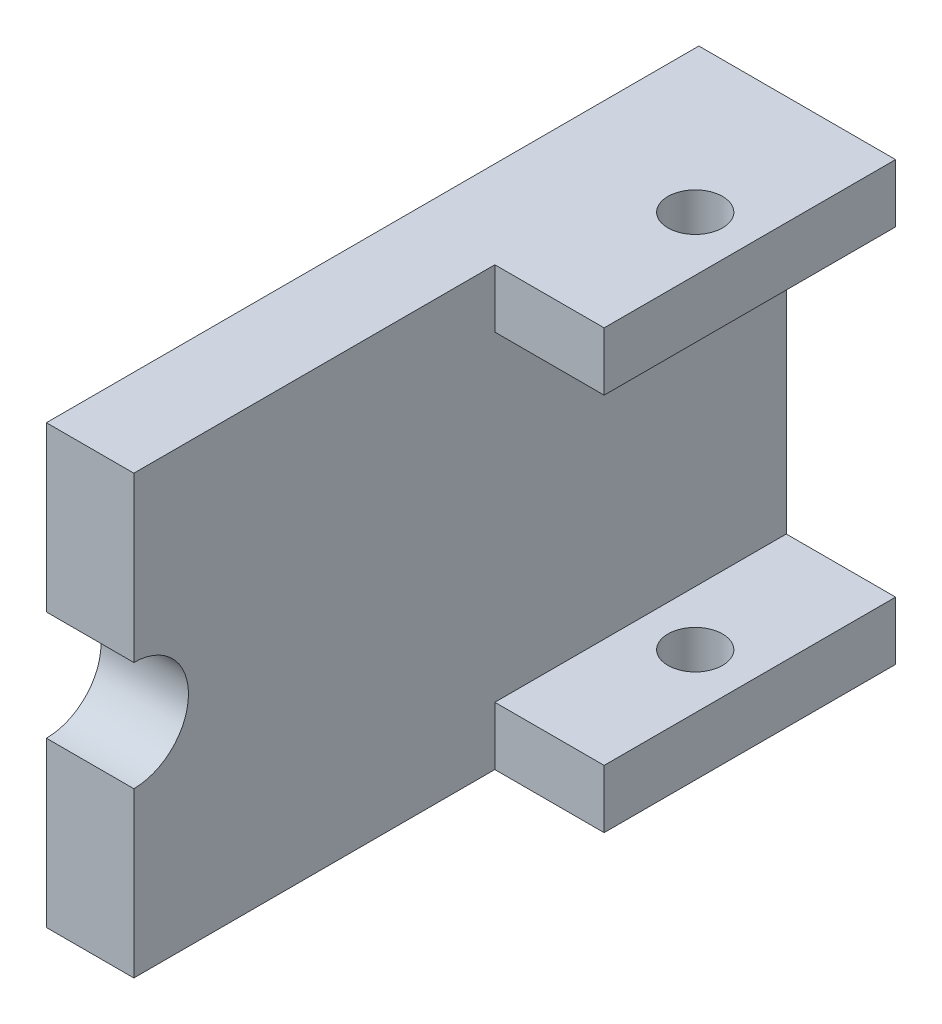
ISO-10303-21;
HEADER;
FILE_DESCRIPTION(('STEP AP214'),'2;1');
FILE_NAME('part.step','',(''),(''),'','','');
FILE_SCHEMA(('AUTOMOTIVE_DESIGN { 1 0 10303 214 1 1 1 1 }'));
ENDSEC;
DATA;
#1=APPLICATION_CONTEXT('core data for automotive mechanical design processes');
#2=APPLICATION_PROTOCOL_DEFINITION('international standard','automotive_design',2000,#1);
#3=PRODUCT_CONTEXT('',#1,'mechanical');
#4=PRODUCT('Part','Part','',(#3));
#5=PRODUCT_RELATED_PRODUCT_CATEGORY('part','',(#4));
#6=PRODUCT_DEFINITION_FORMATION('','',#4);
#7=PRODUCT_DEFINITION_CONTEXT('part definition',#1,'design');
#8=PRODUCT_DEFINITION('design','',#6,#7);
#9=PRODUCT_DEFINITION_SHAPE('','',#8);
#10=(LENGTH_UNIT() NAMED_UNIT(*) SI_UNIT(.MILLI.,.METRE.));
#11=(NAMED_UNIT(*) PLANE_ANGLE_UNIT() SI_UNIT($,.RADIAN.));
#12=(NAMED_UNIT(*) SI_UNIT($,.STERADIAN.) SOLID_ANGLE_UNIT());
#13=UNCERTAINTY_MEASURE_WITH_UNIT(LENGTH_MEASURE(1.E-05),#10,'distance_accuracy_value','');
#14=(GEOMETRIC_REPRESENTATION_CONTEXT(3) GLOBAL_UNCERTAINTY_ASSIGNED_CONTEXT((#13)) GLOBAL_UNIT_ASSIGNED_CONTEXT((#10,
#11,#12)) REPRESENTATION_CONTEXT('',''));
#15=CARTESIAN_POINT('',(0.,0.,0.));
#16=DIRECTION('',(0.,0.,1.));
#17=DIRECTION('',(1.,0.,0.));
#18=AXIS2_PLACEMENT_3D('',#15,#16,#17);
#19=CARTESIAN_POINT('',(24.765,38.1,-31.46060002));
#20=DIRECTION('',(0.,-1.,0.));
#21=DIRECTION('',(0.,0.,-1.));
#22=AXIS2_PLACEMENT_3D('',#19,#20,#21);
#23=CYLINDRICAL_SURFACE('',#22,4.7625);
#24=CARTESIAN_POINT('',(24.765,-27.94,-31.46060002));
#25=DIRECTION('',(0.,-1.,0.));
#26=DIRECTION('',(0.,0.,-1.));
#27=AXIS2_PLACEMENT_3D('',#24,#25,#26);
#28=CIRCLE('',#27,4.7625);
#29=CARTESIAN_POINT('',(24.765,-27.94,-36.22310002));
#30=VERTEX_POINT('',#29);
#31=EDGE_CURVE('E19',#30,#30,#28,.T.);
#32=ORIENTED_EDGE('',*,*,#31,.F.);
#33=EDGE_LOOP('',(#32));
#34=FACE_BOUND('',#33,.T.);
#35=CARTESIAN_POINT('',(24.765,-38.1,-31.46060002));
#36=DIRECTION('',(0.,-1.,0.));
#37=DIRECTION('',(0.,0.,-1.));
#38=AXIS2_PLACEMENT_3D('',#35,#36,#37);
#39=CIRCLE('',#38,4.7625);
#40=CARTESIAN_POINT('',(24.765,-38.1,-36.22310002));
#41=VERTEX_POINT('',#40);
#42=EDGE_CURVE('E143',#41,#41,#39,.T.);
#43=ORIENTED_EDGE('',*,*,#42,.T.);
#44=EDGE_LOOP('',(#43));
#45=FACE_BOUND('',#44,.T.);
#46=ADVANCED_FACE('F16',(#34,#45),#23,.F.);
#47=CARTESIAN_POINT('',(34.29,0.,-6.06060002000003));
#48=DIRECTION('',(0.,0.,-1.));
#49=DIRECTION('',(0.,1.,0.));
#50=AXIS2_PLACEMENT_3D('',#47,#48,#49);
#51=PLANE('',#50);
#52=DIRECTION('',(1.,0.,0.));
#53=VECTOR('',#52,1.);
#54=CARTESIAN_POINT('',(15.24,-38.1,-6.06060002000002));
#55=LINE('',#54,#53);
#56=CARTESIAN_POINT('',(15.24,-38.1,-6.06060002000002));
#57=VERTEX_POINT('',#56);
#58=CARTESIAN_POINT('',(34.29,-38.1,-6.06060002000002));
#59=VERTEX_POINT('',#58);
#60=EDGE_CURVE('E133',#57,#59,#55,.T.);
#61=ORIENTED_EDGE('',*,*,#60,.T.);
#62=DIRECTION('',(0.,1.,0.));
#63=VECTOR('',#62,1.);
#64=CARTESIAN_POINT('',(34.29,0.,-6.06060002000002));
#65=LINE('',#64,#63);
#66=CARTESIAN_POINT('',(34.29,-27.94,-6.06060002000002));
#67=VERTEX_POINT('',#66);
#68=EDGE_CURVE('E117',#67,#59,#65,.F.);
#69=ORIENTED_EDGE('',*,*,#68,.F.);
#70=DIRECTION('',(1.,0.,0.));
#71=VECTOR('',#70,1.);
#72=CARTESIAN_POINT('',(34.29,-27.94,-6.06060002000002));
#73=LINE('',#72,#71);
#74=CARTESIAN_POINT('',(15.24,-27.94,-6.06060002000002));
#75=VERTEX_POINT('',#74);
#76=EDGE_CURVE('E161',#75,#67,#73,.T.);
#77=ORIENTED_EDGE('',*,*,#76,.F.);
#78=DIRECTION('',(0.,1.,0.));
#79=VECTOR('',#78,1.);
#80=CARTESIAN_POINT('',(15.24,0.,-6.06060002000002));
#81=LINE('',#80,#79);
#82=EDGE_CURVE('E139',#57,#75,#81,.T.);
#83=ORIENTED_EDGE('',*,*,#82,.F.);
#84=EDGE_LOOP('',(#61,#69,#77,#83));
#85=FACE_BOUND('',#84,.T.);
#86=ADVANCED_FACE('F138',(#85),#51,.F.);
#87=CARTESIAN_POINT('',(34.29,0.,0.));
#88=DIRECTION('',(1.,0.,0.));
#89=DIRECTION('',(0.,0.,-1.));
#90=AXIS2_PLACEMENT_3D('',#87,#88,#89);
#91=PLANE('',#90);
#92=DIRECTION('',(0.,0.,1.));
#93=VECTOR('',#92,1.);
#94=CARTESIAN_POINT('',(34.29,-27.94,0.));
#95=LINE('',#94,#93);
#96=CARTESIAN_POINT('',(34.29,-27.94,-56.86060002));
#97=VERTEX_POINT('',#96);
#98=EDGE_CURVE('E123',#67,#97,#95,.F.);
#99=ORIENTED_EDGE('',*,*,#98,.F.);
#100=ORIENTED_EDGE('',*,*,#68,.T.);
#101=DIRECTION('',(0.,0.,1.));
#102=VECTOR('',#101,1.);
#103=CARTESIAN_POINT('',(34.29,-38.1,0.));
#104=LINE('',#103,#102);
#105=CARTESIAN_POINT('',(34.29,-38.1,-56.86060002));
#106=VERTEX_POINT('',#105);
#107=EDGE_CURVE('E121',#59,#106,#104,.F.);
#108=ORIENTED_EDGE('',*,*,#107,.T.);
#109=DIRECTION('',(0.,1.,0.));
#110=VECTOR('',#109,1.);
#111=CARTESIAN_POINT('',(34.29,0.,-56.86060002));
#112=LINE('',#111,#110);
#113=EDGE_CURVE('E193',#106,#97,#112,.T.);
#114=ORIENTED_EDGE('',*,*,#113,.T.);
#115=EDGE_LOOP('',(#99,#100,#108,#114));
#116=FACE_BOUND('',#115,.T.);
#117=ADVANCED_FACE('F119',(#116),#91,.T.);
#118=CARTESIAN_POINT('',(34.29,-27.94,0.));
#119=DIRECTION('',(0.,1.,0.));
#120=DIRECTION('',(0.,0.,1.));
#121=AXIS2_PLACEMENT_3D('',#118,#119,#120);
#122=PLANE('',#121);
#123=ORIENTED_EDGE('',*,*,#98,.T.);
#124=DIRECTION('',(1.,0.,0.));
#125=VECTOR('',#124,1.);
#126=CARTESIAN_POINT('',(15.24,-27.94,-56.86060002));
#127=LINE('',#126,#125);
#128=CARTESIAN_POINT('',(15.24,-27.94,-56.86060002));
#129=VERTEX_POINT('',#128);
#130=EDGE_CURVE('E195',#97,#129,#127,.F.);
#131=ORIENTED_EDGE('',*,*,#130,.T.);
#132=DIRECTION('',(0.,0.,-1.));
#133=VECTOR('',#132,1.);
#134=CARTESIAN_POINT('',(15.24,-27.94,0.));
#135=LINE('',#134,#133);
#136=EDGE_CURVE('E151',#75,#129,#135,.T.);
#137=ORIENTED_EDGE('',*,*,#136,.F.);
#138=ORIENTED_EDGE('',*,*,#76,.T.);
#139=EDGE_LOOP('',(#123,#131,#137,#138));
#140=FACE_BOUND('',#139,.T.);
#141=ORIENTED_EDGE('',*,*,#31,.T.);
#142=EDGE_LOOP('',(#141));
#143=FACE_BOUND('',#142,.T.);
#144=ADVANCED_FACE('F272',(#140,#143),#122,.T.);
#145=CARTESIAN_POINT('',(34.29,27.94,0.));
#146=DIRECTION('',(0.,1.,0.));
#147=DIRECTION('',(0.,0.,1.));
#148=AXIS2_PLACEMENT_3D('',#145,#146,#147);
#149=PLANE('',#148);
#150=DIRECTION('',(1.,0.,0.));
#151=VECTOR('',#150,1.);
#152=CARTESIAN_POINT('',(15.24,27.94,-56.86060002));
#153=LINE('',#152,#151);
#154=CARTESIAN_POINT('',(15.24,27.94,-56.86060002));
#155=VERTEX_POINT('',#154);
#156=CARTESIAN_POINT('',(34.29,27.94,-56.86060002));
#157=VERTEX_POINT('',#156);
#158=EDGE_CURVE('E230',#155,#157,#153,.T.);
#159=ORIENTED_EDGE('',*,*,#158,.T.);
#160=DIRECTION('',(0.,0.,-1.));
#161=VECTOR('',#160,1.);
#162=CARTESIAN_POINT('',(34.29,27.94,0.));
#163=LINE('',#162,#161);
#164=CARTESIAN_POINT('',(34.29,27.94,-6.06060002000001));
#165=VERTEX_POINT('',#164);
#166=EDGE_CURVE('E152',#165,#157,#163,.T.);
#167=ORIENTED_EDGE('',*,*,#166,.F.);
#168=DIRECTION('',(1.,0.,0.));
#169=VECTOR('',#168,1.);
#170=CARTESIAN_POINT('',(34.29,27.94,-6.06060002000001));
#171=LINE('',#170,#169);
#172=CARTESIAN_POINT('',(15.24,27.94,-6.06060002000001));
#173=VERTEX_POINT('',#172);
#174=EDGE_CURVE('E155',#173,#165,#171,.T.);
#175=ORIENTED_EDGE('',*,*,#174,.F.);
#176=DIRECTION('',(0.,0.,-1.));
#177=VECTOR('',#176,1.);
#178=CARTESIAN_POINT('',(15.24,27.94,0.));
#179=LINE('',#178,#177);
#180=EDGE_CURVE('E245',#155,#173,#179,.F.);
#181=ORIENTED_EDGE('',*,*,#180,.F.);
#182=EDGE_LOOP('',(#159,#167,#175,#181));
#183=FACE_BOUND('',#182,.T.);
#184=CARTESIAN_POINT('',(24.765,27.94,-31.46060002));
#185=DIRECTION('',(0.,-1.,0.));
#186=DIRECTION('',(0.,0.,-1.));
#187=AXIS2_PLACEMENT_3D('',#184,#185,#186);
#188=CIRCLE('',#187,4.7625);
#189=CARTESIAN_POINT('',(24.765,27.94,-36.22310002));
#190=VERTEX_POINT('',#189);
#191=EDGE_CURVE('E158',#190,#190,#188,.F.);
#192=ORIENTED_EDGE('',*,*,#191,.T.);
#193=EDGE_LOOP('',(#192));
#194=FACE_BOUND('',#193,.T.);
#195=ADVANCED_FACE('F275',(#183,#194),#149,.F.);
#196=CARTESIAN_POINT('',(24.765,38.1,-31.46060002));
#197=DIRECTION('',(0.,-1.,0.));
#198=DIRECTION('',(0.,0.,-1.));
#199=AXIS2_PLACEMENT_3D('',#196,#197,#198);
#200=CYLINDRICAL_SURFACE('',#199,4.7625);
#201=ORIENTED_EDGE('',*,*,#191,.F.);
#202=EDGE_LOOP('',(#201));
#203=FACE_BOUND('',#202,.T.);
#204=CARTESIAN_POINT('',(24.765,38.1,-31.46060002));
#205=DIRECTION('',(0.,-1.,0.));
#206=DIRECTION('',(0.,0.,-1.));
#207=AXIS2_PLACEMENT_3D('',#204,#205,#206);
#208=CIRCLE('',#207,4.7625);
#209=CARTESIAN_POINT('',(24.765,38.1,-36.22310002));
#210=VERTEX_POINT('',#209);
#211=EDGE_CURVE('E173',#210,#210,#208,.T.);
#212=ORIENTED_EDGE('',*,*,#211,.F.);
#213=EDGE_LOOP('',(#212));
#214=FACE_BOUND('',#213,.T.);
#215=ADVANCED_FACE('F318',(#203,#214),#200,.F.);
#216=CARTESIAN_POINT('',(34.29,0.,-6.06060002000001));
#217=DIRECTION('',(0.,0.,1.));
#218=DIRECTION('',(0.,-1.,0.));
#219=AXIS2_PLACEMENT_3D('',#216,#217,#218);
#220=PLANE('',#219);
#221=DIRECTION('',(0.,1.,0.));
#222=VECTOR('',#221,1.);
#223=CARTESIAN_POINT('',(34.29,0.,-6.06060002000001));
#224=LINE('',#223,#222);
#225=CARTESIAN_POINT('',(34.29,38.1,-6.06060002000001));
#226=VERTEX_POINT('',#225);
#227=EDGE_CURVE('E157',#226,#165,#224,.F.);
#228=ORIENTED_EDGE('',*,*,#227,.F.);
#229=DIRECTION('',(1.,0.,0.));
#230=VECTOR('',#229,1.);
#231=CARTESIAN_POINT('',(15.24,38.1,-6.06060002000001));
#232=LINE('',#231,#230);
#233=CARTESIAN_POINT('',(15.24,38.1,-6.06060002000001));
#234=VERTEX_POINT('',#233);
#235=EDGE_CURVE('E225',#234,#226,#232,.T.);
#236=ORIENTED_EDGE('',*,*,#235,.F.);
#237=DIRECTION('',(0.,1.,0.));
#238=VECTOR('',#237,1.);
#239=CARTESIAN_POINT('',(15.24,0.,-6.06060002000001));
#240=LINE('',#239,#238);
#241=EDGE_CURVE('E179',#173,#234,#240,.T.);
#242=ORIENTED_EDGE('',*,*,#241,.F.);
#243=ORIENTED_EDGE('',*,*,#174,.T.);
#244=EDGE_LOOP('',(#228,#236,#242,#243));
#245=FACE_BOUND('',#244,.T.);
#246=ADVANCED_FACE('F320',(#245),#220,.T.);
#247=CARTESIAN_POINT('',(34.29,0.,0.));
#248=DIRECTION('',(1.,0.,0.));
#249=DIRECTION('',(0.,0.,-1.));
#250=AXIS2_PLACEMENT_3D('',#247,#248,#249);
#251=PLANE('',#250);
#252=ORIENTED_EDGE('',*,*,#227,.T.);
#253=ORIENTED_EDGE('',*,*,#166,.T.);
#254=DIRECTION('',(0.,1.,0.));
#255=VECTOR('',#254,1.);
#256=CARTESIAN_POINT('',(34.29,0.,-56.86060002));
#257=LINE('',#256,#255);
#258=CARTESIAN_POINT('',(34.29,38.1,-56.86060002));
#259=VERTEX_POINT('',#258);
#260=EDGE_CURVE('E177',#157,#259,#257,.T.);
#261=ORIENTED_EDGE('',*,*,#260,.T.);
#262=DIRECTION('',(0.,0.,1.));
#263=VECTOR('',#262,1.);
#264=CARTESIAN_POINT('',(34.29,38.1,0.));
#265=LINE('',#264,#263);
#266=EDGE_CURVE('E233',#226,#259,#265,.F.);
#267=ORIENTED_EDGE('',*,*,#266,.F.);
#268=EDGE_LOOP('',(#252,#253,#261,#267));
#269=FACE_BOUND('',#268,.T.);
#270=ADVANCED_FACE('F292',(#269),#251,.T.);
#271=CARTESIAN_POINT('',(15.24,0.,0.));
#272=DIRECTION('',(1.,0.,0.));
#273=DIRECTION('',(0.,0.,-1.));
#274=AXIS2_PLACEMENT_3D('',#271,#272,#273);
#275=PLANE('',#274);
#276=DIRECTION('',(0.,1.,0.));
#277=VECTOR('',#276,1.);
#278=CARTESIAN_POINT('',(15.24,0.,56.86060002));
#279=LINE('',#278,#277);
#280=CARTESIAN_POINT('',(15.24,9.52499999999998,56.86060002));
#281=VERTEX_POINT('',#280);
#282=CARTESIAN_POINT('',(15.24,38.1,56.86060002));
#283=VERTEX_POINT('',#282);
#284=EDGE_CURVE('E69',#281,#283,#279,.T.);
#285=ORIENTED_EDGE('',*,*,#284,.F.);
#286=CARTESIAN_POINT('',(15.24,0.,56.86060002));
#287=DIRECTION('',(1.,0.,0.));
#288=DIRECTION('',(0.,0.,-1.));
#289=AXIS2_PLACEMENT_3D('',#286,#287,#288);
#290=CIRCLE('',#289,9.525);
#291=CARTESIAN_POINT('',(15.24,-9.52500000000001,56.86060002));
#292=VERTEX_POINT('',#291);
#293=EDGE_CURVE('E53',#281,#292,#290,.F.);
#294=ORIENTED_EDGE('',*,*,#293,.T.);
#295=DIRECTION('',(0.,1.,0.));
#296=VECTOR('',#295,1.);
#297=CARTESIAN_POINT('',(15.24,0.,56.86060002));
#298=LINE('',#297,#296);
#299=CARTESIAN_POINT('',(15.24,-38.1,56.86060002));
#300=VERTEX_POINT('',#299);
#301=EDGE_CURVE('E207',#300,#292,#298,.T.);
#302=ORIENTED_EDGE('',*,*,#301,.F.);
#303=DIRECTION('',(0.,0.,1.));
#304=VECTOR('',#303,1.);
#305=CARTESIAN_POINT('',(15.24,-38.1,0.));
#306=LINE('',#305,#304);
#307=EDGE_CURVE('E140',#300,#57,#306,.F.);
#308=ORIENTED_EDGE('',*,*,#307,.T.);
#309=ORIENTED_EDGE('',*,*,#82,.T.);
#310=ORIENTED_EDGE('',*,*,#136,.T.);
#311=DIRECTION('',(0.,1.,0.));
#312=VECTOR('',#311,1.);
#313=CARTESIAN_POINT('',(15.24,0.,-56.86060002));
#314=LINE('',#313,#312);
#315=EDGE_CURVE('E199',#129,#155,#314,.T.);
#316=ORIENTED_EDGE('',*,*,#315,.T.);
#317=ORIENTED_EDGE('',*,*,#180,.T.);
#318=ORIENTED_EDGE('',*,*,#241,.T.);
#319=DIRECTION('',(0.,0.,1.));
#320=VECTOR('',#319,1.);
#321=CARTESIAN_POINT('',(15.24,38.1,0.));
#322=LINE('',#321,#320);
#323=EDGE_CURVE('E176',#283,#234,#322,.F.);
#324=ORIENTED_EDGE('',*,*,#323,.F.);
#325=EDGE_LOOP('',(#285,#294,#302,#308,#309,#310,#316,#317,#318,#324));
#326=FACE_BOUND('',#325,.T.);
#327=ADVANCED_FACE('F266',(#326),#275,.T.);
#328=CARTESIAN_POINT('',(15.24,-38.1,0.));
#329=DIRECTION('',(0.,1.,0.));
#330=DIRECTION('',(0.,0.,1.));
#331=AXIS2_PLACEMENT_3D('',#328,#329,#330);
#332=PLANE('',#331);
#333=DIRECTION('',(1.,0.,0.));
#334=VECTOR('',#333,1.);
#335=CARTESIAN_POINT('',(15.24,-38.1,-56.86060002));
#336=LINE('',#335,#334);
#337=CARTESIAN_POINT('',(0.,-38.1,-56.86060002));
#338=VERTEX_POINT('',#337);
#339=EDGE_CURVE('E136',#338,#106,#336,.T.);
#340=ORIENTED_EDGE('',*,*,#339,.T.);
#341=ORIENTED_EDGE('',*,*,#107,.F.);
#342=ORIENTED_EDGE('',*,*,#60,.F.);
#343=ORIENTED_EDGE('',*,*,#307,.F.);
#344=DIRECTION('',(1.,0.,0.));
#345=VECTOR('',#344,1.);
#346=CARTESIAN_POINT('',(15.24,-38.1,56.86060002));
#347=LINE('',#346,#345);
#348=CARTESIAN_POINT('',(0.,-38.1,56.86060002));
#349=VERTEX_POINT('',#348);
#350=EDGE_CURVE('E211',#349,#300,#347,.T.);
#351=ORIENTED_EDGE('',*,*,#350,.F.);
#352=DIRECTION('',(0.,0.,-1.));
#353=VECTOR('',#352,1.);
#354=CARTESIAN_POINT('',(0.,-38.1,0.));
#355=LINE('',#354,#353);
#356=EDGE_CURVE('E210',#349,#338,#355,.T.);
#357=ORIENTED_EDGE('',*,*,#356,.T.);
#358=EDGE_LOOP('',(#340,#341,#342,#343,#351,#357));
#359=FACE_BOUND('',#358,.T.);
#360=ORIENTED_EDGE('',*,*,#42,.F.);
#361=EDGE_LOOP('',(#360));
#362=FACE_BOUND('',#361,.T.);
#363=ADVANCED_FACE('F131',(#359,#362),#332,.F.);
#364=CARTESIAN_POINT('',(15.24,0.,-56.86060002));
#365=DIRECTION('',(0.,0.,1.));
#366=DIRECTION('',(1.,0.,0.));
#367=AXIS2_PLACEMENT_3D('',#364,#365,#366);
#368=PLANE('',#367);
#369=DIRECTION('',(1.,0.,0.));
#370=VECTOR('',#369,1.);
#371=CARTESIAN_POINT('',(15.24,38.1,-56.86060002));
#372=LINE('',#371,#370);
#373=CARTESIAN_POINT('',(0.,38.1,-56.86060002));
#374=VERTEX_POINT('',#373);
#375=EDGE_CURVE('E219',#259,#374,#372,.F.);
#376=ORIENTED_EDGE('',*,*,#375,.F.);
#377=ORIENTED_EDGE('',*,*,#260,.F.);
#378=ORIENTED_EDGE('',*,*,#158,.F.);
#379=ORIENTED_EDGE('',*,*,#315,.F.);
#380=ORIENTED_EDGE('',*,*,#130,.F.);
#381=ORIENTED_EDGE('',*,*,#113,.F.);
#382=ORIENTED_EDGE('',*,*,#339,.F.);
#383=DIRECTION('',(0.,1.,0.));
#384=VECTOR('',#383,1.);
#385=CARTESIAN_POINT('',(0.,0.,-56.86060002));
#386=LINE('',#385,#384);
#387=EDGE_CURVE('E507',#338,#374,#386,.T.);
#388=ORIENTED_EDGE('',*,*,#387,.T.);
#389=EDGE_LOOP('',(#376,#377,#378,#379,#380,#381,#382,#388));
#390=FACE_BOUND('',#389,.T.);
#391=ADVANCED_FACE('F270',(#390),#368,.F.);
#392=CARTESIAN_POINT('',(15.24,38.1,0.));
#393=DIRECTION('',(0.,1.,0.));
#394=DIRECTION('',(0.,0.,1.));
#395=AXIS2_PLACEMENT_3D('',#392,#393,#394);
#396=PLANE('',#395);
#397=ORIENTED_EDGE('',*,*,#266,.T.);
#398=ORIENTED_EDGE('',*,*,#375,.T.);
#399=DIRECTION('',(0.,0.,-1.));
#400=VECTOR('',#399,1.);
#401=CARTESIAN_POINT('',(0.,38.1,0.));
#402=LINE('',#401,#400);
#403=CARTESIAN_POINT('',(0.,38.1,56.86060002));
#404=VERTEX_POINT('',#403);
#405=EDGE_CURVE('E492',#374,#404,#402,.F.);
#406=ORIENTED_EDGE('',*,*,#405,.T.);
#407=DIRECTION('',(1.,0.,0.));
#408=VECTOR('',#407,1.);
#409=CARTESIAN_POINT('',(15.24,38.1,56.86060002));
#410=LINE('',#409,#408);
#411=EDGE_CURVE('E218',#283,#404,#410,.F.);
#412=ORIENTED_EDGE('',*,*,#411,.F.);
#413=ORIENTED_EDGE('',*,*,#323,.T.);
#414=ORIENTED_EDGE('',*,*,#235,.T.);
#415=EDGE_LOOP('',(#397,#398,#406,#412,#413,#414));
#416=FACE_BOUND('',#415,.T.);
#417=ORIENTED_EDGE('',*,*,#211,.T.);
#418=EDGE_LOOP('',(#417));
#419=FACE_BOUND('',#418,.T.);
#420=ADVANCED_FACE('F289',(#416,#419),#396,.T.);
#421=CARTESIAN_POINT('',(15.24,0.,56.86060002));
#422=DIRECTION('',(0.,0.,1.));
#423=DIRECTION('',(1.,0.,0.));
#424=AXIS2_PLACEMENT_3D('',#421,#422,#423);
#425=PLANE('',#424);
#426=ORIENTED_EDGE('',*,*,#411,.T.);
#427=DIRECTION('',(0.,1.,0.));
#428=VECTOR('',#427,1.);
#429=CARTESIAN_POINT('',(0.,0.,56.86060002));
#430=LINE('',#429,#428);
#431=CARTESIAN_POINT('',(0.,9.52499999999998,56.86060002));
#432=VERTEX_POINT('',#431);
#433=EDGE_CURVE('E168',#404,#432,#430,.F.);
#434=ORIENTED_EDGE('',*,*,#433,.T.);
#435=DIRECTION('',(1.,0.,0.));
#436=VECTOR('',#435,1.);
#437=CARTESIAN_POINT('',(0.,9.52499999999998,56.86060002));
#438=LINE('',#437,#436);
#439=EDGE_CURVE('E172',#432,#281,#438,.T.);
#440=ORIENTED_EDGE('',*,*,#439,.T.);
#441=ORIENTED_EDGE('',*,*,#284,.T.);
#442=EDGE_LOOP('',(#426,#434,#440,#441));
#443=FACE_BOUND('',#442,.T.);
#444=ADVANCED_FACE('F307',(#443),#425,.T.);
#445=CARTESIAN_POINT('',(0.,0.,56.86060002));
#446=DIRECTION('',(1.,0.,0.));
#447=DIRECTION('',(0.,0.,-1.));
#448=AXIS2_PLACEMENT_3D('',#445,#446,#447);
#449=CYLINDRICAL_SURFACE('',#448,9.525);
#450=CARTESIAN_POINT('',(0.,0.,56.86060002));
#451=DIRECTION('',(1.,0.,0.));
#452=DIRECTION('',(0.,0.,-1.));
#453=AXIS2_PLACEMENT_3D('',#450,#451,#452);
#454=CIRCLE('',#453,9.525);
#455=CARTESIAN_POINT('',(0.,-9.52500000000001,56.86060002));
#456=VERTEX_POINT('',#455);
#457=EDGE_CURVE('E26',#432,#456,#454,.F.);
#458=ORIENTED_EDGE('',*,*,#457,.T.);
#459=DIRECTION('',(1.,0.,0.));
#460=VECTOR('',#459,1.);
#461=CARTESIAN_POINT('',(15.24,-9.52500000000001,56.86060002));
#462=LINE('',#461,#460);
#463=EDGE_CURVE('E171',#292,#456,#462,.F.);
#464=ORIENTED_EDGE('',*,*,#463,.F.);
#465=ORIENTED_EDGE('',*,*,#293,.F.);
#466=ORIENTED_EDGE('',*,*,#439,.F.);
#467=EDGE_LOOP('',(#458,#464,#465,#466));
#468=FACE_BOUND('',#467,.T.);
#469=ADVANCED_FACE('F301',(#468),#449,.F.);
#470=CARTESIAN_POINT('',(15.24,0.,56.86060002));
#471=DIRECTION('',(0.,0.,1.));
#472=DIRECTION('',(1.,0.,0.));
#473=AXIS2_PLACEMENT_3D('',#470,#471,#472);
#474=PLANE('',#473);
#475=ORIENTED_EDGE('',*,*,#350,.T.);
#476=ORIENTED_EDGE('',*,*,#301,.T.);
#477=ORIENTED_EDGE('',*,*,#463,.T.);
#478=DIRECTION('',(0.,1.,0.));
#479=VECTOR('',#478,1.);
#480=CARTESIAN_POINT('',(0.,0.,56.86060002));
#481=LINE('',#480,#479);
#482=EDGE_CURVE('E11',#456,#349,#481,.F.);
#483=ORIENTED_EDGE('',*,*,#482,.T.);
#484=EDGE_LOOP('',(#475,#476,#477,#483));
#485=FACE_BOUND('',#484,.T.);
#486=ADVANCED_FACE('F296',(#485),#474,.T.);
#487=CARTESIAN_POINT('',(0.,0.,0.));
#488=DIRECTION('',(1.,0.,0.));
#489=DIRECTION('',(0.,0.,-1.));
#490=AXIS2_PLACEMENT_3D('',#487,#488,#489);
#491=PLANE('',#490);
#492=ORIENTED_EDGE('',*,*,#482,.F.);
#493=ORIENTED_EDGE('',*,*,#457,.F.);
#494=ORIENTED_EDGE('',*,*,#433,.F.);
#495=ORIENTED_EDGE('',*,*,#405,.F.);
#496=ORIENTED_EDGE('',*,*,#387,.F.);
#497=ORIENTED_EDGE('',*,*,#356,.F.);
#498=EDGE_LOOP('',(#492,#493,#494,#495,#496,#497));
#499=FACE_BOUND('',#498,.T.);
#500=ADVANCED_FACE('F294',(#499),#491,.F.);
#501=CLOSED_SHELL('',(#46,#86,#117,#144,#195,#215,#246,#270,#327,#363,#391,#420,#444,#469,#486,#500));
#502=MANIFOLD_SOLID_BREP('B1',#501);
#503=ADVANCED_BREP_SHAPE_REPRESENTATION('',(#18,#502),#14);
#504=SHAPE_DEFINITION_REPRESENTATION(#9,#503);
ENDSEC;
END-ISO-10303-21;
